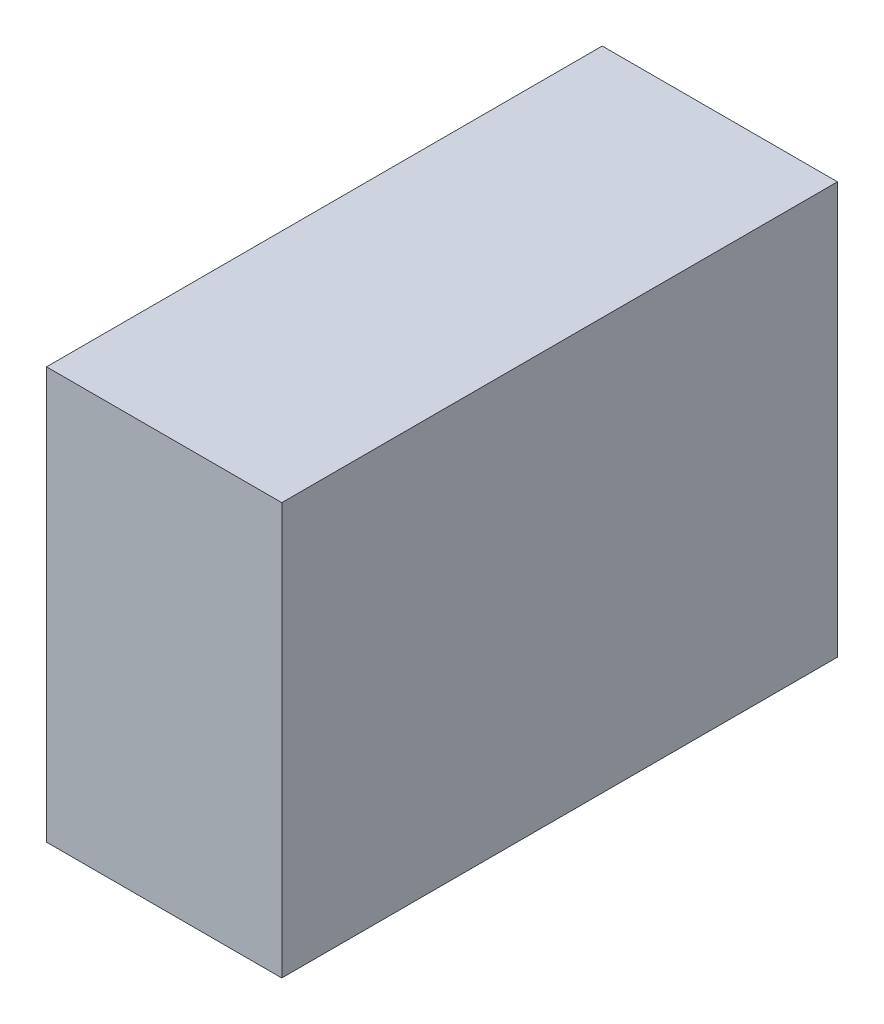
ISO-10303-21;
HEADER;
FILE_DESCRIPTION(('STEP AP214'),'2;1');
FILE_NAME('part.step','',(''),(''),'','','');
FILE_SCHEMA(('AUTOMOTIVE_DESIGN { 1 0 10303 214 1 1 1 1 }'));
ENDSEC;
DATA;
#1=APPLICATION_CONTEXT('core data for automotive mechanical design processes');
#2=APPLICATION_PROTOCOL_DEFINITION('international standard','automotive_design',2000,#1);
#3=PRODUCT_CONTEXT('',#1,'mechanical');
#4=PRODUCT('Part','Part','',(#3));
#5=PRODUCT_RELATED_PRODUCT_CATEGORY('part','',(#4));
#6=PRODUCT_DEFINITION_FORMATION('','',#4);
#7=PRODUCT_DEFINITION_CONTEXT('part definition',#1,'design');
#8=PRODUCT_DEFINITION('design','',#6,#7);
#9=PRODUCT_DEFINITION_SHAPE('','',#8);
#10=(LENGTH_UNIT() NAMED_UNIT(*) SI_UNIT(.MILLI.,.METRE.));
#11=(NAMED_UNIT(*) PLANE_ANGLE_UNIT() SI_UNIT($,.RADIAN.));
#12=(NAMED_UNIT(*) SI_UNIT($,.STERADIAN.) SOLID_ANGLE_UNIT());
#13=UNCERTAINTY_MEASURE_WITH_UNIT(LENGTH_MEASURE(1.E-05),#10,'distance_accuracy_value','');
#14=(GEOMETRIC_REPRESENTATION_CONTEXT(3) GLOBAL_UNCERTAINTY_ASSIGNED_CONTEXT((#13)) GLOBAL_UNIT_ASSIGNED_CONTEXT((#10,
#11,#12)) REPRESENTATION_CONTEXT('',''));
#15=CARTESIAN_POINT('',(0.,0.,0.));
#16=DIRECTION('',(0.,0.,1.));
#17=DIRECTION('',(1.,0.,0.));
#18=AXIS2_PLACEMENT_3D('',#15,#16,#17);
#19=CARTESIAN_POINT('',(12.7,22.225,60.));
#20=DIRECTION('',(-1.,0.,0.));
#21=DIRECTION('',(0.,-1.,0.));
#22=AXIS2_PLACEMENT_3D('',#19,#20,#21);
#23=PLANE('',#22);
#24=DIRECTION('',(0.,1.,0.));
#25=VECTOR('',#24,1.);
#26=CARTESIAN_POINT('',(12.7,22.225,0.));
#27=LINE('',#26,#25);
#28=CARTESIAN_POINT('',(12.7,-22.225,0.));
#29=VERTEX_POINT('',#28);
#30=CARTESIAN_POINT('',(12.7,22.225,0.));
#31=VERTEX_POINT('',#30);
#32=EDGE_CURVE('E95',#29,#31,#27,.T.);
#33=ORIENTED_EDGE('',*,*,#32,.T.);
#34=DIRECTION('',(0.,0.,-1.));
#35=VECTOR('',#34,1.);
#36=CARTESIAN_POINT('',(12.7,22.225,60.));
#37=LINE('',#36,#35);
#38=CARTESIAN_POINT('',(12.7,22.225,60.));
#39=VERTEX_POINT('',#38);
#40=EDGE_CURVE('E11',#39,#31,#37,.T.);
#41=ORIENTED_EDGE('',*,*,#40,.F.);
#42=DIRECTION('',(0.,1.,0.));
#43=VECTOR('',#42,1.);
#44=CARTESIAN_POINT('',(12.7,22.225,60.));
#45=LINE('',#44,#43);
#46=CARTESIAN_POINT('',(12.7,-22.225,60.));
#47=VERTEX_POINT('',#46);
#48=EDGE_CURVE('E83',#47,#39,#45,.T.);
#49=ORIENTED_EDGE('',*,*,#48,.F.);
#50=DIRECTION('',(0.,0.,-1.));
#51=VECTOR('',#50,1.);
#52=CARTESIAN_POINT('',(12.7,-22.225,60.));
#53=LINE('',#52,#51);
#54=EDGE_CURVE('E91',#47,#29,#53,.T.);
#55=ORIENTED_EDGE('',*,*,#54,.T.);
#56=EDGE_LOOP('',(#33,#41,#49,#55));
#57=FACE_BOUND('',#56,.T.);
#58=ADVANCED_FACE('F32',(#57),#23,.F.);
#59=CARTESIAN_POINT('',(-12.7,22.225,60.));
#60=DIRECTION('',(0.,-1.,0.));
#61=DIRECTION('',(0.,0.,-1.));
#62=AXIS2_PLACEMENT_3D('',#59,#60,#61);
#63=PLANE('',#62);
#64=DIRECTION('',(-1.,0.,0.));
#65=VECTOR('',#64,1.);
#66=CARTESIAN_POINT('',(-12.7,22.225,0.));
#67=LINE('',#66,#65);
#68=CARTESIAN_POINT('',(-12.7,22.225,0.));
#69=VERTEX_POINT('',#68);
#70=EDGE_CURVE('E87',#31,#69,#67,.T.);
#71=ORIENTED_EDGE('',*,*,#70,.T.);
#72=DIRECTION('',(0.,0.,-1.));
#73=VECTOR('',#72,1.);
#74=CARTESIAN_POINT('',(-12.7,22.225,60.));
#75=LINE('',#74,#73);
#76=CARTESIAN_POINT('',(-12.7,22.225,60.));
#77=VERTEX_POINT('',#76);
#78=EDGE_CURVE('E40',#77,#69,#75,.T.);
#79=ORIENTED_EDGE('',*,*,#78,.F.);
#80=DIRECTION('',(-1.,0.,0.));
#81=VECTOR('',#80,1.);
#82=CARTESIAN_POINT('',(-12.7,22.225,60.));
#83=LINE('',#82,#81);
#84=EDGE_CURVE('E78',#39,#77,#83,.T.);
#85=ORIENTED_EDGE('',*,*,#84,.F.);
#86=ORIENTED_EDGE('',*,*,#40,.T.);
#87=EDGE_LOOP('',(#71,#79,#85,#86));
#88=FACE_BOUND('',#87,.T.);
#89=ADVANCED_FACE('F86',(#88),#63,.F.);
#90=CARTESIAN_POINT('',(-12.7,22.225,60.));
#91=DIRECTION('',(1.,0.,0.));
#92=DIRECTION('',(0.,1.,0.));
#93=AXIS2_PLACEMENT_3D('',#90,#91,#92);
#94=PLANE('',#93);
#95=DIRECTION('',(0.,-1.,0.));
#96=VECTOR('',#95,1.);
#97=CARTESIAN_POINT('',(-12.7,22.225,0.));
#98=LINE('',#97,#96);
#99=CARTESIAN_POINT('',(-12.7,-22.225,0.));
#100=VERTEX_POINT('',#99);
#101=EDGE_CURVE('E65',#69,#100,#98,.T.);
#102=ORIENTED_EDGE('',*,*,#101,.T.);
#103=DIRECTION('',(0.,0.,-1.));
#104=VECTOR('',#103,1.);
#105=CARTESIAN_POINT('',(-12.7,-22.225,60.));
#106=LINE('',#105,#104);
#107=CARTESIAN_POINT('',(-12.7,-22.225,60.));
#108=VERTEX_POINT('',#107);
#109=EDGE_CURVE('E88',#108,#100,#106,.T.);
#110=ORIENTED_EDGE('',*,*,#109,.F.);
#111=DIRECTION('',(0.,-1.,0.));
#112=VECTOR('',#111,1.);
#113=CARTESIAN_POINT('',(-12.7,22.225,60.));
#114=LINE('',#113,#112);
#115=EDGE_CURVE('E81',#77,#108,#114,.T.);
#116=ORIENTED_EDGE('',*,*,#115,.F.);
#117=ORIENTED_EDGE('',*,*,#78,.T.);
#118=EDGE_LOOP('',(#102,#110,#116,#117));
#119=FACE_BOUND('',#118,.T.);
#120=ADVANCED_FACE('F89',(#119),#94,.F.);
#121=CARTESIAN_POINT('',(-12.7,-22.225,60.));
#122=DIRECTION('',(0.,1.,0.));
#123=DIRECTION('',(0.,0.,1.));
#124=AXIS2_PLACEMENT_3D('',#121,#122,#123);
#125=PLANE('',#124);
#126=DIRECTION('',(1.,0.,0.));
#127=VECTOR('',#126,1.);
#128=CARTESIAN_POINT('',(-12.7,-22.225,0.));
#129=LINE('',#128,#127);
#130=EDGE_CURVE('E71',#100,#29,#129,.T.);
#131=ORIENTED_EDGE('',*,*,#130,.T.);
#132=ORIENTED_EDGE('',*,*,#54,.F.);
#133=DIRECTION('',(1.,0.,0.));
#134=VECTOR('',#133,1.);
#135=CARTESIAN_POINT('',(-12.7,-22.225,60.));
#136=LINE('',#135,#134);
#137=EDGE_CURVE('E48',#108,#47,#136,.T.);
#138=ORIENTED_EDGE('',*,*,#137,.F.);
#139=ORIENTED_EDGE('',*,*,#109,.T.);
#140=EDGE_LOOP('',(#131,#132,#138,#139));
#141=FACE_BOUND('',#140,.T.);
#142=ADVANCED_FACE('F102',(#141),#125,.F.);
#143=CARTESIAN_POINT('',(0.,0.,60.));
#144=DIRECTION('',(0.,0.,1.));
#145=DIRECTION('',(1.,0.,0.));
#146=AXIS2_PLACEMENT_3D('',#143,#144,#145);
#147=PLANE('',#146);
#148=ORIENTED_EDGE('',*,*,#48,.T.);
#149=ORIENTED_EDGE('',*,*,#84,.T.);
#150=ORIENTED_EDGE('',*,*,#115,.T.);
#151=ORIENTED_EDGE('',*,*,#137,.T.);
#152=EDGE_LOOP('',(#148,#149,#150,#151));
#153=FACE_BOUND('',#152,.T.);
#154=ADVANCED_FACE('F79',(#153),#147,.T.);
#155=CARTESIAN_POINT('',(0.,0.,0.));
#156=DIRECTION('',(0.,0.,1.));
#157=DIRECTION('',(1.,0.,0.));
#158=AXIS2_PLACEMENT_3D('',#155,#156,#157);
#159=PLANE('',#158);
#160=ORIENTED_EDGE('',*,*,#32,.F.);
#161=ORIENTED_EDGE('',*,*,#130,.F.);
#162=ORIENTED_EDGE('',*,*,#101,.F.);
#163=ORIENTED_EDGE('',*,*,#70,.F.);
#164=EDGE_LOOP('',(#160,#161,#162,#163));
#165=FACE_BOUND('',#164,.T.);
#166=ADVANCED_FACE('F105',(#165),#159,.F.);
#167=CLOSED_SHELL('',(#58,#89,#120,#142,#154,#166));
#168=MANIFOLD_SOLID_BREP('B2',#167);
#169=ADVANCED_BREP_SHAPE_REPRESENTATION('',(#18,#168),#14);
#170=SHAPE_DEFINITION_REPRESENTATION(#9,#169);
ENDSEC;
END-ISO-10303-21;
